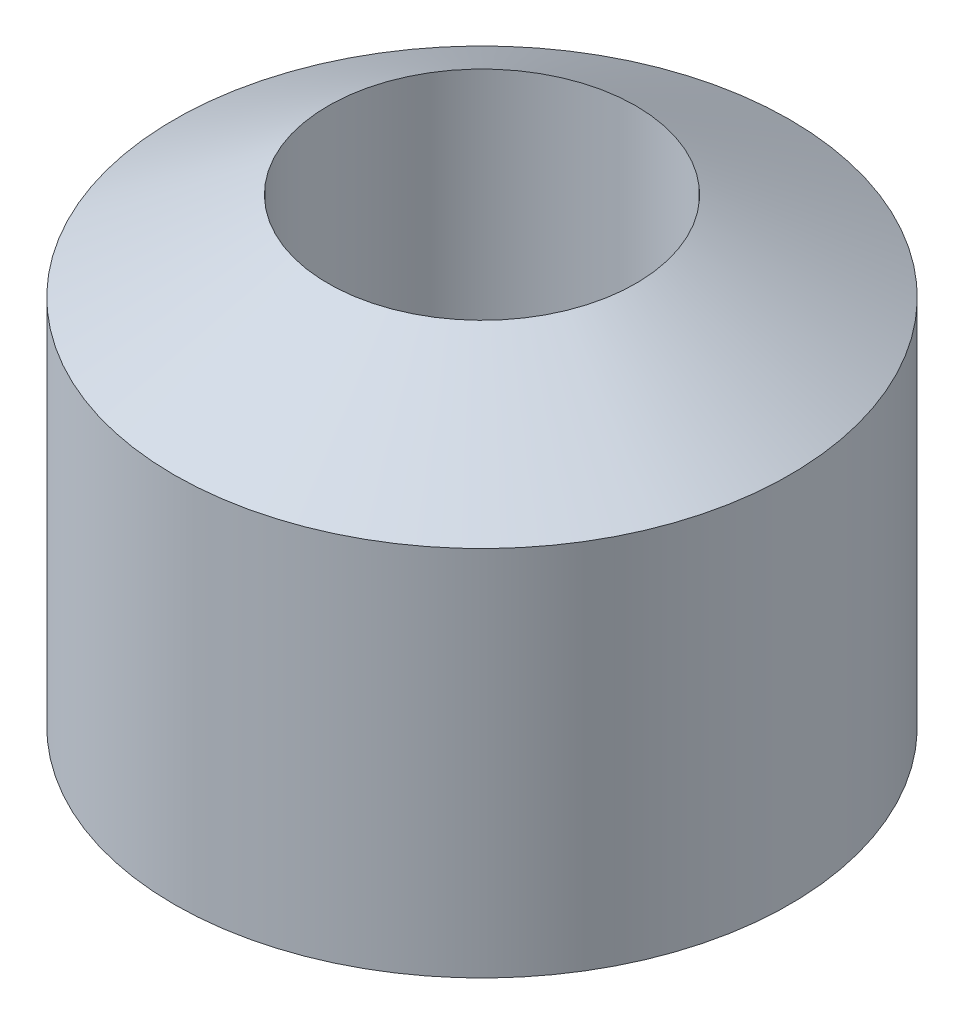
ISO-10303-21;
HEADER;
FILE_DESCRIPTION(('STEP AP214'),'2;1');
FILE_NAME('part.step','',(''),(''),'','','');
FILE_SCHEMA(('AUTOMOTIVE_DESIGN { 1 0 10303 214 1 1 1 1 }'));
ENDSEC;
DATA;
#1=APPLICATION_CONTEXT('core data for automotive mechanical design processes');
#2=APPLICATION_PROTOCOL_DEFINITION('international standard','automotive_design',2000,#1);
#3=PRODUCT_CONTEXT('',#1,'mechanical');
#4=PRODUCT('Part','Part','',(#3));
#5=PRODUCT_RELATED_PRODUCT_CATEGORY('part','',(#4));
#6=PRODUCT_DEFINITION_FORMATION('','',#4);
#7=PRODUCT_DEFINITION_CONTEXT('part definition',#1,'design');
#8=PRODUCT_DEFINITION('design','',#6,#7);
#9=PRODUCT_DEFINITION_SHAPE('','',#8);
#10=(LENGTH_UNIT() NAMED_UNIT(*) SI_UNIT(.MILLI.,.METRE.));
#11=(NAMED_UNIT(*) PLANE_ANGLE_UNIT() SI_UNIT($,.RADIAN.));
#12=(NAMED_UNIT(*) SI_UNIT($,.STERADIAN.) SOLID_ANGLE_UNIT());
#13=UNCERTAINTY_MEASURE_WITH_UNIT(LENGTH_MEASURE(1.E-05),#10,'distance_accuracy_value','');
#14=(GEOMETRIC_REPRESENTATION_CONTEXT(3) GLOBAL_UNCERTAINTY_ASSIGNED_CONTEXT((#13)) GLOBAL_UNIT_ASSIGNED_CONTEXT((#10,
#11,#12)) REPRESENTATION_CONTEXT('',''));
#15=CARTESIAN_POINT('',(0.,0.,0.));
#16=DIRECTION('',(0.,0.,1.));
#17=DIRECTION('',(1.,0.,0.));
#18=AXIS2_PLACEMENT_3D('',#15,#16,#17);
#19=CARTESIAN_POINT('',(0.,41.9170962313452,0.));
#20=DIRECTION('',(0.,-1.,0.));
#21=DIRECTION('',(0.,0.,-1.));
#22=AXIS2_PLACEMENT_3D('',#19,#20,#21);
#23=CONICAL_SURFACE('',#22,28.,1.04719755119659);
#24=CARTESIAN_POINT('',(0.,50.,0.));
#25=DIRECTION('',(0.,-1.,0.));
#26=DIRECTION('',(0.,0.,-1.));
#27=AXIS2_PLACEMENT_3D('',#24,#25,#26);
#28=CIRCLE('',#27,14.);
#29=CARTESIAN_POINT('',(0.,50.,-14.));
#30=VERTEX_POINT('',#29);
#31=EDGE_CURVE('E10',#30,#30,#28,.T.);
#32=ORIENTED_EDGE('',*,*,#31,.T.);
#33=EDGE_LOOP('',(#32));
#34=FACE_BOUND('',#33,.T.);
#35=CARTESIAN_POINT('',(0.,41.9170962313452,0.));
#36=DIRECTION('',(0.,-1.,0.));
#37=DIRECTION('',(0.,0.,-1.));
#38=AXIS2_PLACEMENT_3D('',#35,#36,#37);
#39=CIRCLE('',#38,28.);
#40=CARTESIAN_POINT('',(0.,41.9170962313452,-28.));
#41=VERTEX_POINT('',#40);
#42=EDGE_CURVE('E62',#41,#41,#39,.T.);
#43=ORIENTED_EDGE('',*,*,#42,.F.);
#44=EDGE_LOOP('',(#43));
#45=FACE_BOUND('',#44,.T.);
#46=ADVANCED_FACE('F45',(#34,#45),#23,.T.);
#47=CARTESIAN_POINT('',(0.,0.,0.));
#48=DIRECTION('',(0.,-1.,0.));
#49=DIRECTION('',(0.,0.,-1.));
#50=AXIS2_PLACEMENT_3D('',#47,#48,#49);
#51=CYLINDRICAL_SURFACE('',#50,14.);
#52=CARTESIAN_POINT('',(0.,0.,0.));
#53=DIRECTION('',(0.,-1.,0.));
#54=DIRECTION('',(0.,0.,-1.));
#55=AXIS2_PLACEMENT_3D('',#52,#53,#54);
#56=CIRCLE('',#55,14.);
#57=CARTESIAN_POINT('',(0.,0.,-14.));
#58=VERTEX_POINT('',#57);
#59=EDGE_CURVE('E52',#58,#58,#56,.T.);
#60=ORIENTED_EDGE('',*,*,#59,.T.);
#61=EDGE_LOOP('',(#60));
#62=FACE_BOUND('',#61,.T.);
#63=ORIENTED_EDGE('',*,*,#31,.F.);
#64=EDGE_LOOP('',(#63));
#65=FACE_BOUND('',#64,.T.);
#66=ADVANCED_FACE('F73',(#62,#65),#51,.F.);
#67=CARTESIAN_POINT('',(0.,0.,0.));
#68=DIRECTION('',(0.,1.,0.));
#69=DIRECTION('',(0.,0.,1.));
#70=AXIS2_PLACEMENT_3D('',#67,#68,#69);
#71=CONICAL_SURFACE('',#70,14.,1.04719755119659);
#72=CARTESIAN_POINT('',(0.,8.08290376865485,0.));
#73=DIRECTION('',(0.,-1.,0.));
#74=DIRECTION('',(0.,0.,-1.));
#75=AXIS2_PLACEMENT_3D('',#72,#73,#74);
#76=CIRCLE('',#75,28.);
#77=CARTESIAN_POINT('',(0.,8.08290376865485,-28.));
#78=VERTEX_POINT('',#77);
#79=EDGE_CURVE('E57',#78,#78,#76,.T.);
#80=ORIENTED_EDGE('',*,*,#79,.T.);
#81=EDGE_LOOP('',(#80));
#82=FACE_BOUND('',#81,.T.);
#83=ORIENTED_EDGE('',*,*,#59,.F.);
#84=EDGE_LOOP('',(#83));
#85=FACE_BOUND('',#84,.T.);
#86=ADVANCED_FACE('F77',(#82,#85),#71,.T.);
#87=CARTESIAN_POINT('',(0.,0.,0.));
#88=DIRECTION('',(0.,-1.,0.));
#89=DIRECTION('',(0.,0.,-1.));
#90=AXIS2_PLACEMENT_3D('',#87,#88,#89);
#91=CYLINDRICAL_SURFACE('',#90,28.);
#92=ORIENTED_EDGE('',*,*,#42,.T.);
#93=EDGE_LOOP('',(#92));
#94=FACE_BOUND('',#93,.T.);
#95=ORIENTED_EDGE('',*,*,#79,.F.);
#96=EDGE_LOOP('',(#95));
#97=FACE_BOUND('',#96,.T.);
#98=ADVANCED_FACE('F69',(#94,#97),#91,.T.);
#99=CLOSED_SHELL('',(#46,#66,#86,#98));
#100=MANIFOLD_SOLID_BREP('B2',#99);
#101=ADVANCED_BREP_SHAPE_REPRESENTATION('',(#18,#100),#14);
#102=SHAPE_DEFINITION_REPRESENTATION(#9,#101);
ENDSEC;
END-ISO-10303-21;
